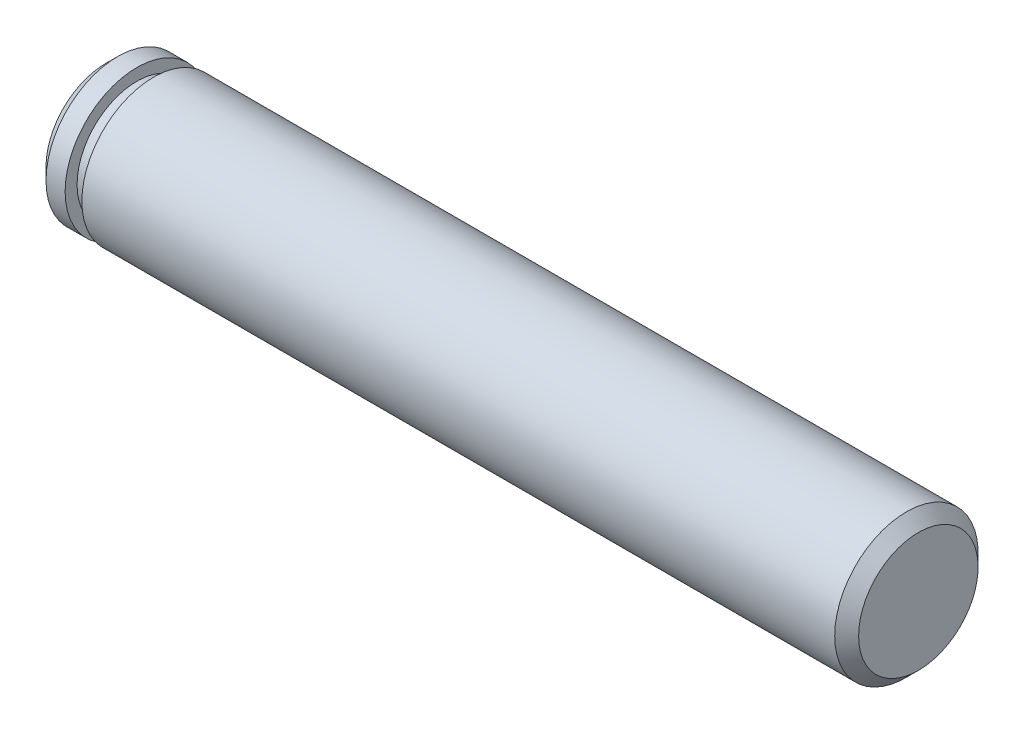
ISO-10303-21;
HEADER;
FILE_DESCRIPTION(('STEP AP214'),'2;1');
FILE_NAME('part.step','',(''),(''),'','','');
FILE_SCHEMA(('AUTOMOTIVE_DESIGN { 1 0 10303 214 1 1 1 1 }'));
ENDSEC;
DATA;
#1=APPLICATION_CONTEXT('core data for automotive mechanical design processes');
#2=APPLICATION_PROTOCOL_DEFINITION('international standard','automotive_design',2000,#1);
#3=PRODUCT_CONTEXT('',#1,'mechanical');
#4=PRODUCT('Part','Part','',(#3));
#5=PRODUCT_RELATED_PRODUCT_CATEGORY('part','',(#4));
#6=PRODUCT_DEFINITION_FORMATION('','',#4);
#7=PRODUCT_DEFINITION_CONTEXT('part definition',#1,'design');
#8=PRODUCT_DEFINITION('design','',#6,#7);
#9=PRODUCT_DEFINITION_SHAPE('','',#8);
#10=(LENGTH_UNIT() NAMED_UNIT(*) SI_UNIT(.MILLI.,.METRE.));
#11=(NAMED_UNIT(*) PLANE_ANGLE_UNIT() SI_UNIT($,.RADIAN.));
#12=(NAMED_UNIT(*) SI_UNIT($,.STERADIAN.) SOLID_ANGLE_UNIT());
#13=UNCERTAINTY_MEASURE_WITH_UNIT(LENGTH_MEASURE(1.E-05),#10,'distance_accuracy_value','');
#14=(GEOMETRIC_REPRESENTATION_CONTEXT(3) GLOBAL_UNCERTAINTY_ASSIGNED_CONTEXT((#13)) GLOBAL_UNIT_ASSIGNED_CONTEXT((#10,
#11,#12)) REPRESENTATION_CONTEXT('',''));
#15=CARTESIAN_POINT('',(0.,0.,0.));
#16=DIRECTION('',(0.,0.,1.));
#17=DIRECTION('',(1.,0.,0.));
#18=AXIS2_PLACEMENT_3D('',#15,#16,#17);
#19=CARTESIAN_POINT('',(0.,0.,0.));
#20=DIRECTION('',(1.,0.,0.));
#21=DIRECTION('',(0.,0.,-1.));
#22=AXIS2_PLACEMENT_3D('',#19,#20,#21);
#23=PLANE('',#22);
#24=CARTESIAN_POINT('',(0.,0.,0.));
#25=DIRECTION('',(-1.,0.,0.));
#26=DIRECTION('',(0.,0.,1.));
#27=AXIS2_PLACEMENT_3D('',#24,#25,#26);
#28=CIRCLE('',#27,3.);
#29=CARTESIAN_POINT('',(0.,0.,3.));
#30=VERTEX_POINT('',#29);
#31=EDGE_CURVE('E37',#30,#30,#28,.T.);
#32=ORIENTED_EDGE('',*,*,#31,.T.);
#33=EDGE_LOOP('',(#32));
#34=FACE_BOUND('',#33,.T.);
#35=CARTESIAN_POINT('',(0.,0.,0.));
#36=DIRECTION('',(1.,0.,0.));
#37=DIRECTION('',(0.,0.,-1.));
#38=AXIS2_PLACEMENT_3D('',#35,#36,#37);
#39=CIRCLE('',#38,2.5);
#40=CARTESIAN_POINT('',(0.,0.,-2.5));
#41=VERTEX_POINT('',#40);
#42=EDGE_CURVE('E10',#41,#41,#39,.F.);
#43=ORIENTED_EDGE('',*,*,#42,.F.);
#44=EDGE_LOOP('',(#43));
#45=FACE_BOUND('',#44,.T.);
#46=ADVANCED_FACE('F31',(#34,#45),#23,.F.);
#47=CARTESIAN_POINT('',(32.,0.,0.));
#48=DIRECTION('',(-1.,0.,0.));
#49=DIRECTION('',(0.,0.,1.));
#50=AXIS2_PLACEMENT_3D('',#47,#48,#49);
#51=CYLINDRICAL_SURFACE('',#50,3.);
#52=ORIENTED_EDGE('',*,*,#31,.F.);
#53=EDGE_LOOP('',(#52));
#54=FACE_BOUND('',#53,.T.);
#55=CARTESIAN_POINT('',(31.5,0.,0.));
#56=DIRECTION('',(-1.,0.,0.));
#57=DIRECTION('',(0.,0.,1.));
#58=AXIS2_PLACEMENT_3D('',#55,#56,#57);
#59=CIRCLE('',#58,3.);
#60=CARTESIAN_POINT('',(31.5,0.,3.));
#61=VERTEX_POINT('',#60);
#62=EDGE_CURVE('E41',#61,#61,#59,.T.);
#63=ORIENTED_EDGE('',*,*,#62,.T.);
#64=EDGE_LOOP('',(#63));
#65=FACE_BOUND('',#64,.T.);
#66=ADVANCED_FACE('F75',(#54,#65),#51,.T.);
#67=CARTESIAN_POINT('',(32.,0.,0.));
#68=DIRECTION('',(-1.,0.,0.));
#69=DIRECTION('',(0.,0.,1.));
#70=AXIS2_PLACEMENT_3D('',#67,#68,#69);
#71=CONICAL_SURFACE('',#70,2.5,0.785398163397448);
#72=ORIENTED_EDGE('',*,*,#62,.F.);
#73=EDGE_LOOP('',(#72));
#74=FACE_BOUND('',#73,.T.);
#75=CARTESIAN_POINT('',(32.,0.,0.));
#76=DIRECTION('',(-1.,0.,0.));
#77=DIRECTION('',(0.,0.,1.));
#78=AXIS2_PLACEMENT_3D('',#75,#76,#77);
#79=CIRCLE('',#78,2.5);
#80=CARTESIAN_POINT('',(32.,0.,2.5));
#81=VERTEX_POINT('',#80);
#82=EDGE_CURVE('E45',#81,#81,#79,.T.);
#83=ORIENTED_EDGE('',*,*,#82,.T.);
#84=EDGE_LOOP('',(#83));
#85=FACE_BOUND('',#84,.T.);
#86=ADVANCED_FACE('F79',(#74,#85),#71,.T.);
#87=CARTESIAN_POINT('',(32.,2.5,0.));
#88=DIRECTION('',(-1.,0.,0.));
#89=DIRECTION('',(0.,0.,1.));
#90=AXIS2_PLACEMENT_3D('',#87,#88,#89);
#91=PLANE('',#90);
#92=ORIENTED_EDGE('',*,*,#82,.F.);
#93=EDGE_LOOP('',(#92));
#94=FACE_BOUND('',#93,.T.);
#95=ADVANCED_FACE('F85',(#94),#91,.F.);
#96=CARTESIAN_POINT('',(-2.,0.,0.));
#97=DIRECTION('',(1.,0.,0.));
#98=DIRECTION('',(0.,0.,-1.));
#99=AXIS2_PLACEMENT_3D('',#96,#97,#98);
#100=PLANE('',#99);
#101=CARTESIAN_POINT('',(-2.,0.,0.));
#102=DIRECTION('',(-1.,0.,0.));
#103=DIRECTION('',(0.,0.,1.));
#104=AXIS2_PLACEMENT_3D('',#101,#102,#103);
#105=CIRCLE('',#104,2.5);
#106=CARTESIAN_POINT('',(-2.,0.,2.5));
#107=VERTEX_POINT('',#106);
#108=EDGE_CURVE('E50',#107,#107,#105,.T.);
#109=ORIENTED_EDGE('',*,*,#108,.T.);
#110=EDGE_LOOP('',(#109));
#111=FACE_BOUND('',#110,.T.);
#112=ADVANCED_FACE('F92',(#111),#100,.F.);
#113=CARTESIAN_POINT('',(-1.5,0.,0.));
#114=DIRECTION('',(1.,0.,0.));
#115=DIRECTION('',(0.,0.,-1.));
#116=AXIS2_PLACEMENT_3D('',#113,#114,#115);
#117=CONICAL_SURFACE('',#116,3.,0.785398163397448);
#118=ORIENTED_EDGE('',*,*,#108,.F.);
#119=EDGE_LOOP('',(#118));
#120=FACE_BOUND('',#119,.T.);
#121=CARTESIAN_POINT('',(-1.5,0.,0.));
#122=DIRECTION('',(-1.,0.,0.));
#123=DIRECTION('',(0.,0.,1.));
#124=AXIS2_PLACEMENT_3D('',#121,#122,#123);
#125=CIRCLE('',#124,3.);
#126=CARTESIAN_POINT('',(-1.5,0.,3.));
#127=VERTEX_POINT('',#126);
#128=EDGE_CURVE('E53',#127,#127,#125,.T.);
#129=ORIENTED_EDGE('',*,*,#128,.T.);
#130=EDGE_LOOP('',(#129));
#131=FACE_BOUND('',#130,.T.);
#132=ADVANCED_FACE('F96',(#120,#131),#117,.T.);
#133=CARTESIAN_POINT('',(0.,0.,0.));
#134=DIRECTION('',(-1.,0.,0.));
#135=DIRECTION('',(0.,0.,1.));
#136=AXIS2_PLACEMENT_3D('',#133,#134,#135);
#137=CYLINDRICAL_SURFACE('',#136,3.);
#138=ORIENTED_EDGE('',*,*,#128,.F.);
#139=EDGE_LOOP('',(#138));
#140=FACE_BOUND('',#139,.T.);
#141=CARTESIAN_POINT('',(-0.7,0.,0.));
#142=DIRECTION('',(-1.,0.,0.));
#143=DIRECTION('',(0.,0.,1.));
#144=AXIS2_PLACEMENT_3D('',#141,#142,#143);
#145=CIRCLE('',#144,3.);
#146=CARTESIAN_POINT('',(-0.7,0.,3.));
#147=VERTEX_POINT('',#146);
#148=EDGE_CURVE('E56',#147,#147,#145,.T.);
#149=ORIENTED_EDGE('',*,*,#148,.T.);
#150=EDGE_LOOP('',(#149));
#151=FACE_BOUND('',#150,.T.);
#152=ADVANCED_FACE('F71',(#140,#151),#137,.T.);
#153=CARTESIAN_POINT('',(-0.7,3.,0.));
#154=DIRECTION('',(-1.,0.,0.));
#155=DIRECTION('',(0.,0.,1.));
#156=AXIS2_PLACEMENT_3D('',#153,#154,#155);
#157=PLANE('',#156);
#158=ORIENTED_EDGE('',*,*,#148,.F.);
#159=EDGE_LOOP('',(#158));
#160=FACE_BOUND('',#159,.T.);
#161=CARTESIAN_POINT('',(-0.7,0.,0.));
#162=DIRECTION('',(-1.,0.,0.));
#163=DIRECTION('',(0.,0.,1.));
#164=AXIS2_PLACEMENT_3D('',#161,#162,#163);
#165=CIRCLE('',#164,2.5);
#166=CARTESIAN_POINT('',(-0.7,0.,2.5));
#167=VERTEX_POINT('',#166);
#168=EDGE_CURVE('E59',#167,#167,#165,.T.);
#169=ORIENTED_EDGE('',*,*,#168,.T.);
#170=EDGE_LOOP('',(#169));
#171=FACE_BOUND('',#170,.T.);
#172=ADVANCED_FACE('F63',(#160,#171),#157,.F.);
#173=CARTESIAN_POINT('',(0.,0.,0.));
#174=DIRECTION('',(-1.,0.,0.));
#175=DIRECTION('',(0.,0.,1.));
#176=AXIS2_PLACEMENT_3D('',#173,#174,#175);
#177=CYLINDRICAL_SURFACE('',#176,2.5);
#178=ORIENTED_EDGE('',*,*,#168,.F.);
#179=EDGE_LOOP('',(#178));
#180=FACE_BOUND('',#179,.T.);
#181=ORIENTED_EDGE('',*,*,#42,.T.);
#182=EDGE_LOOP('',(#181));
#183=FACE_BOUND('',#182,.T.);
#184=ADVANCED_FACE('F65',(#180,#183),#177,.T.);
#185=CLOSED_SHELL('',(#46,#66,#86,#95,#112,#132,#152,#172,#184));
#186=MANIFOLD_SOLID_BREP('B2',#185);
#187=ADVANCED_BREP_SHAPE_REPRESENTATION('',(#18,#186),#14);
#188=SHAPE_DEFINITION_REPRESENTATION(#9,#187);
ENDSEC;
END-ISO-10303-21;
